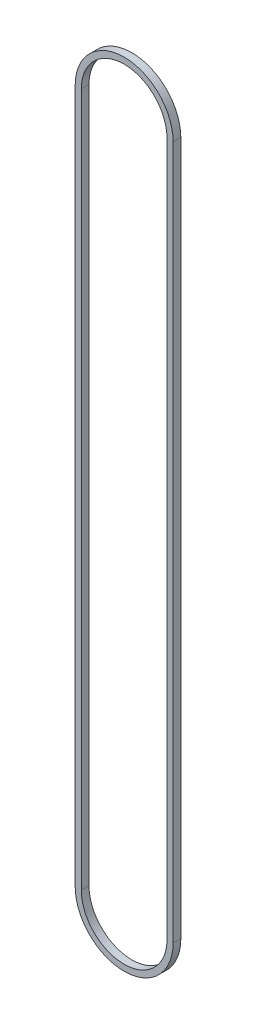
ISO-10303-21;
HEADER;
FILE_DESCRIPTION(('STEP AP214'),'2;1');
FILE_NAME('part.step','',(''),(''),'','','');
FILE_SCHEMA(('AUTOMOTIVE_DESIGN { 1 0 10303 214 1 1 1 1 }'));
ENDSEC;
DATA;
#1=APPLICATION_CONTEXT('core data for automotive mechanical design processes');
#2=APPLICATION_PROTOCOL_DEFINITION('international standard','automotive_design',2000,#1);
#3=PRODUCT_CONTEXT('',#1,'mechanical');
#4=PRODUCT('Part','Part','',(#3));
#5=PRODUCT_RELATED_PRODUCT_CATEGORY('part','',(#4));
#6=PRODUCT_DEFINITION_FORMATION('','',#4);
#7=PRODUCT_DEFINITION_CONTEXT('part definition',#1,'design');
#8=PRODUCT_DEFINITION('design','',#6,#7);
#9=PRODUCT_DEFINITION_SHAPE('','',#8);
#10=(LENGTH_UNIT() NAMED_UNIT(*) SI_UNIT(.MILLI.,.METRE.));
#11=(NAMED_UNIT(*) PLANE_ANGLE_UNIT() SI_UNIT($,.RADIAN.));
#12=(NAMED_UNIT(*) SI_UNIT($,.STERADIAN.) SOLID_ANGLE_UNIT());
#13=UNCERTAINTY_MEASURE_WITH_UNIT(LENGTH_MEASURE(1.E-05),#10,'distance_accuracy_value','');
#14=(GEOMETRIC_REPRESENTATION_CONTEXT(3) GLOBAL_UNCERTAINTY_ASSIGNED_CONTEXT((#13)) GLOBAL_UNIT_ASSIGNED_CONTEXT((#10,
#11,#12)) REPRESENTATION_CONTEXT('',''));
#15=CARTESIAN_POINT('',(0.,0.,0.));
#16=DIRECTION('',(0.,0.,1.));
#17=DIRECTION('',(1.,0.,0.));
#18=AXIS2_PLACEMENT_3D('',#15,#16,#17);
#19=CARTESIAN_POINT('',(-1.04094977927525E-13,850.,18.82));
#20=DIRECTION('',(0.,0.,1.));
#21=DIRECTION('',(1.,0.,0.));
#22=AXIS2_PLACEMENT_3D('',#19,#20,#21);
#23=PLANE('',#22);
#24=CARTESIAN_POINT('',(-1.04094977927525E-13,850.,18.82));
#25=DIRECTION('',(0.,0.,1.));
#26=DIRECTION('',(1.,0.,0.));
#27=AXIS2_PLACEMENT_3D('',#24,#25,#26);
#28=CIRCLE('',#27,120.);
#29=CARTESIAN_POINT('',(120.,850.,18.82));
#30=VERTEX_POINT('',#29);
#31=CARTESIAN_POINT('',(-120.,850.,18.82));
#32=VERTEX_POINT('',#31);
#33=EDGE_CURVE('E134',#30,#32,#28,.T.);
#34=ORIENTED_EDGE('',*,*,#33,.T.);
#35=DIRECTION('',(0.,-1.,0.));
#36=VECTOR('',#35,1.);
#37=CARTESIAN_POINT('',(-120.,850.,18.82));
#38=LINE('',#37,#36);
#39=CARTESIAN_POINT('',(-120.,-850.,18.82));
#40=VERTEX_POINT('',#39);
#41=EDGE_CURVE('E137',#32,#40,#38,.T.);
#42=ORIENTED_EDGE('',*,*,#41,.T.);
#43=CARTESIAN_POINT('',(0.,-850.,18.82));
#44=DIRECTION('',(0.,0.,1.));
#45=DIRECTION('',(1.,0.,0.));
#46=AXIS2_PLACEMENT_3D('',#43,#44,#45);
#47=CIRCLE('',#46,120.);
#48=CARTESIAN_POINT('',(120.,-850.,18.82));
#49=VERTEX_POINT('',#48);
#50=EDGE_CURVE('E140',#40,#49,#47,.T.);
#51=ORIENTED_EDGE('',*,*,#50,.T.);
#52=DIRECTION('',(0.,1.,0.));
#53=VECTOR('',#52,1.);
#54=CARTESIAN_POINT('',(120.,850.,18.82));
#55=LINE('',#54,#53);
#56=EDGE_CURVE('E142',#49,#30,#55,.T.);
#57=ORIENTED_EDGE('',*,*,#56,.T.);
#58=EDGE_LOOP('',(#34,#42,#51,#57));
#59=FACE_BOUND('',#58,.T.);
#60=DIRECTION('',(0.,-1.,0.));
#61=VECTOR('',#60,1.);
#62=CARTESIAN_POINT('',(-105.,850.,18.82));
#63=LINE('',#62,#61);
#64=CARTESIAN_POINT('',(-105.,850.,18.82));
#65=VERTEX_POINT('',#64);
#66=CARTESIAN_POINT('',(-105.,-850.,18.82));
#67=VERTEX_POINT('',#66);
#68=EDGE_CURVE('E106',#65,#67,#63,.T.);
#69=ORIENTED_EDGE('',*,*,#68,.F.);
#70=CARTESIAN_POINT('',(-1.04094977927525E-13,850.,18.82));
#71=DIRECTION('',(0.,0.,1.));
#72=DIRECTION('',(1.,0.,0.));
#73=AXIS2_PLACEMENT_3D('',#70,#71,#72);
#74=CIRCLE('',#73,105.);
#75=CARTESIAN_POINT('',(104.999999999999,850.,18.82));
#76=VERTEX_POINT('',#75);
#77=EDGE_CURVE('E98',#76,#65,#74,.T.);
#78=ORIENTED_EDGE('',*,*,#77,.F.);
#79=DIRECTION('',(0.,1.,0.));
#80=VECTOR('',#79,1.);
#81=CARTESIAN_POINT('',(104.999999999999,850.,18.82));
#82=LINE('',#81,#80);
#83=CARTESIAN_POINT('',(105.,-850.,18.82));
#84=VERTEX_POINT('',#83);
#85=EDGE_CURVE('E120',#84,#76,#82,.T.);
#86=ORIENTED_EDGE('',*,*,#85,.F.);
#87=CARTESIAN_POINT('',(0.,-850.,18.82));
#88=DIRECTION('',(0.,0.,1.));
#89=DIRECTION('',(1.,0.,0.));
#90=AXIS2_PLACEMENT_3D('',#87,#88,#89);
#91=CIRCLE('',#90,105.);
#92=EDGE_CURVE('E118',#67,#84,#91,.T.);
#93=ORIENTED_EDGE('',*,*,#92,.F.);
#94=EDGE_LOOP('',(#69,#78,#86,#93));
#95=FACE_BOUND('',#94,.T.);
#96=ADVANCED_FACE('F33',(#59,#95),#23,.T.);
#97=CARTESIAN_POINT('',(-1.04094977927525E-13,850.,0.));
#98=DIRECTION('',(0.,0.,1.));
#99=DIRECTION('',(1.,0.,0.));
#100=AXIS2_PLACEMENT_3D('',#97,#98,#99);
#101=PLANE('',#100);
#102=CARTESIAN_POINT('',(-1.04094977927525E-13,850.,0.));
#103=DIRECTION('',(0.,0.,1.));
#104=DIRECTION('',(1.,0.,0.));
#105=AXIS2_PLACEMENT_3D('',#102,#103,#104);
#106=CIRCLE('',#105,120.);
#107=CARTESIAN_POINT('',(120.,850.,0.));
#108=VERTEX_POINT('',#107);
#109=CARTESIAN_POINT('',(-120.,850.,0.));
#110=VERTEX_POINT('',#109);
#111=EDGE_CURVE('E114',#108,#110,#106,.T.);
#112=ORIENTED_EDGE('',*,*,#111,.F.);
#113=DIRECTION('',(0.,1.,0.));
#114=VECTOR('',#113,1.);
#115=CARTESIAN_POINT('',(120.,850.,0.));
#116=LINE('',#115,#114);
#117=CARTESIAN_POINT('',(120.,-850.,0.));
#118=VERTEX_POINT('',#117);
#119=EDGE_CURVE('E138',#118,#108,#116,.T.);
#120=ORIENTED_EDGE('',*,*,#119,.F.);
#121=CARTESIAN_POINT('',(0.,-850.,0.));
#122=DIRECTION('',(0.,0.,1.));
#123=DIRECTION('',(1.,0.,0.));
#124=AXIS2_PLACEMENT_3D('',#121,#122,#123);
#125=CIRCLE('',#124,120.);
#126=CARTESIAN_POINT('',(-120.,-850.,0.));
#127=VERTEX_POINT('',#126);
#128=EDGE_CURVE('E149',#127,#118,#125,.T.);
#129=ORIENTED_EDGE('',*,*,#128,.F.);
#130=DIRECTION('',(0.,-1.,0.));
#131=VECTOR('',#130,1.);
#132=CARTESIAN_POINT('',(-120.,850.,0.));
#133=LINE('',#132,#131);
#134=EDGE_CURVE('E147',#110,#127,#133,.T.);
#135=ORIENTED_EDGE('',*,*,#134,.F.);
#136=EDGE_LOOP('',(#112,#120,#129,#135));
#137=FACE_BOUND('',#136,.T.);
#138=CARTESIAN_POINT('',(-1.04094977927525E-13,850.,0.));
#139=DIRECTION('',(0.,0.,1.));
#140=DIRECTION('',(1.,0.,0.));
#141=AXIS2_PLACEMENT_3D('',#138,#139,#140);
#142=CIRCLE('',#141,105.);
#143=CARTESIAN_POINT('',(104.999999999999,850.,0.));
#144=VERTEX_POINT('',#143);
#145=CARTESIAN_POINT('',(-105.,850.,0.));
#146=VERTEX_POINT('',#145);
#147=EDGE_CURVE('E56',#144,#146,#142,.T.);
#148=ORIENTED_EDGE('',*,*,#147,.T.);
#149=DIRECTION('',(0.,-1.,0.));
#150=VECTOR('',#149,1.);
#151=CARTESIAN_POINT('',(-105.,850.,0.));
#152=LINE('',#151,#150);
#153=CARTESIAN_POINT('',(-105.,-850.,0.));
#154=VERTEX_POINT('',#153);
#155=EDGE_CURVE('E113',#146,#154,#152,.T.);
#156=ORIENTED_EDGE('',*,*,#155,.T.);
#157=CARTESIAN_POINT('',(0.,-850.,0.));
#158=DIRECTION('',(0.,0.,1.));
#159=DIRECTION('',(1.,0.,0.));
#160=AXIS2_PLACEMENT_3D('',#157,#158,#159);
#161=CIRCLE('',#160,105.);
#162=CARTESIAN_POINT('',(105.,-850.,0.));
#163=VERTEX_POINT('',#162);
#164=EDGE_CURVE('E126',#154,#163,#161,.T.);
#165=ORIENTED_EDGE('',*,*,#164,.T.);
#166=DIRECTION('',(0.,1.,0.));
#167=VECTOR('',#166,1.);
#168=CARTESIAN_POINT('',(104.999999999999,850.,0.));
#169=LINE('',#168,#167);
#170=EDGE_CURVE('E107',#163,#144,#169,.T.);
#171=ORIENTED_EDGE('',*,*,#170,.T.);
#172=EDGE_LOOP('',(#148,#156,#165,#171));
#173=FACE_BOUND('',#172,.T.);
#174=ADVANCED_FACE('F167',(#137,#173),#101,.F.);
#175=CARTESIAN_POINT('',(-1.04094977927525E-13,850.,18.82));
#176=DIRECTION('',(0.,0.,-1.));
#177=DIRECTION('',(-1.,0.,0.));
#178=AXIS2_PLACEMENT_3D('',#175,#176,#177);
#179=CYLINDRICAL_SURFACE('',#178,120.);
#180=ORIENTED_EDGE('',*,*,#111,.T.);
#181=DIRECTION('',(0.,0.,-1.));
#182=VECTOR('',#181,1.);
#183=CARTESIAN_POINT('',(-120.,850.,18.82));
#184=LINE('',#183,#182);
#185=EDGE_CURVE('E11',#32,#110,#184,.T.);
#186=ORIENTED_EDGE('',*,*,#185,.F.);
#187=ORIENTED_EDGE('',*,*,#33,.F.);
#188=DIRECTION('',(0.,0.,-1.));
#189=VECTOR('',#188,1.);
#190=CARTESIAN_POINT('',(120.,850.,18.82));
#191=LINE('',#190,#189);
#192=EDGE_CURVE('E144',#30,#108,#191,.T.);
#193=ORIENTED_EDGE('',*,*,#192,.T.);
#194=EDGE_LOOP('',(#180,#186,#187,#193));
#195=FACE_BOUND('',#194,.T.);
#196=ADVANCED_FACE('F35',(#195),#179,.T.);
#197=CARTESIAN_POINT('',(-120.,850.,18.82));
#198=DIRECTION('',(1.,0.,0.));
#199=DIRECTION('',(0.,1.,0.));
#200=AXIS2_PLACEMENT_3D('',#197,#198,#199);
#201=PLANE('',#200);
#202=ORIENTED_EDGE('',*,*,#134,.T.);
#203=DIRECTION('',(0.,0.,-1.));
#204=VECTOR('',#203,1.);
#205=CARTESIAN_POINT('',(-120.,-850.,18.82));
#206=LINE('',#205,#204);
#207=EDGE_CURVE('E41',#40,#127,#206,.T.);
#208=ORIENTED_EDGE('',*,*,#207,.F.);
#209=ORIENTED_EDGE('',*,*,#41,.F.);
#210=ORIENTED_EDGE('',*,*,#185,.T.);
#211=EDGE_LOOP('',(#202,#208,#209,#210));
#212=FACE_BOUND('',#211,.T.);
#213=ADVANCED_FACE('F177',(#212),#201,.F.);
#214=CARTESIAN_POINT('',(0.,-850.,18.82));
#215=DIRECTION('',(0.,0.,-1.));
#216=DIRECTION('',(-1.,0.,0.));
#217=AXIS2_PLACEMENT_3D('',#214,#215,#216);
#218=CYLINDRICAL_SURFACE('',#217,120.);
#219=ORIENTED_EDGE('',*,*,#128,.T.);
#220=DIRECTION('',(0.,0.,-1.));
#221=VECTOR('',#220,1.);
#222=CARTESIAN_POINT('',(120.,-850.,18.82));
#223=LINE('',#222,#221);
#224=EDGE_CURVE('E154',#49,#118,#223,.T.);
#225=ORIENTED_EDGE('',*,*,#224,.F.);
#226=ORIENTED_EDGE('',*,*,#50,.F.);
#227=ORIENTED_EDGE('',*,*,#207,.T.);
#228=EDGE_LOOP('',(#219,#225,#226,#227));
#229=FACE_BOUND('',#228,.T.);
#230=ADVANCED_FACE('F161',(#229),#218,.T.);
#231=CARTESIAN_POINT('',(120.,850.,18.82));
#232=DIRECTION('',(-1.,0.,0.));
#233=DIRECTION('',(0.,-1.,0.));
#234=AXIS2_PLACEMENT_3D('',#231,#232,#233);
#235=PLANE('',#234);
#236=ORIENTED_EDGE('',*,*,#119,.T.);
#237=ORIENTED_EDGE('',*,*,#192,.F.);
#238=ORIENTED_EDGE('',*,*,#56,.F.);
#239=ORIENTED_EDGE('',*,*,#224,.T.);
#240=EDGE_LOOP('',(#236,#237,#238,#239));
#241=FACE_BOUND('',#240,.T.);
#242=ADVANCED_FACE('F171',(#241),#235,.F.);
#243=CARTESIAN_POINT('',(-1.04094977927525E-13,850.,18.82));
#244=DIRECTION('',(0.,0.,-1.));
#245=DIRECTION('',(-1.,0.,0.));
#246=AXIS2_PLACEMENT_3D('',#243,#244,#245);
#247=CYLINDRICAL_SURFACE('',#246,105.);
#248=ORIENTED_EDGE('',*,*,#147,.F.);
#249=DIRECTION('',(0.,0.,-1.));
#250=VECTOR('',#249,1.);
#251=CARTESIAN_POINT('',(104.999999999999,850.,18.82));
#252=LINE('',#251,#250);
#253=EDGE_CURVE('E102',#76,#144,#252,.T.);
#254=ORIENTED_EDGE('',*,*,#253,.F.);
#255=ORIENTED_EDGE('',*,*,#77,.T.);
#256=DIRECTION('',(0.,0.,-1.));
#257=VECTOR('',#256,1.);
#258=CARTESIAN_POINT('',(-105.,850.,18.82));
#259=LINE('',#258,#257);
#260=EDGE_CURVE('E101',#65,#146,#259,.T.);
#261=ORIENTED_EDGE('',*,*,#260,.T.);
#262=EDGE_LOOP('',(#248,#254,#255,#261));
#263=FACE_BOUND('',#262,.T.);
#264=ADVANCED_FACE('F100',(#263),#247,.F.);
#265=CARTESIAN_POINT('',(-105.,850.,18.82));
#266=DIRECTION('',(1.,0.,0.));
#267=DIRECTION('',(0.,1.,0.));
#268=AXIS2_PLACEMENT_3D('',#265,#266,#267);
#269=PLANE('',#268);
#270=ORIENTED_EDGE('',*,*,#155,.F.);
#271=ORIENTED_EDGE('',*,*,#260,.F.);
#272=ORIENTED_EDGE('',*,*,#68,.T.);
#273=DIRECTION('',(0.,0.,-1.));
#274=VECTOR('',#273,1.);
#275=CARTESIAN_POINT('',(-105.,-850.,18.82));
#276=LINE('',#275,#274);
#277=EDGE_CURVE('E115',#67,#154,#276,.T.);
#278=ORIENTED_EDGE('',*,*,#277,.T.);
#279=EDGE_LOOP('',(#270,#271,#272,#278));
#280=FACE_BOUND('',#279,.T.);
#281=ADVANCED_FACE('F110',(#280),#269,.T.);
#282=CARTESIAN_POINT('',(0.,-850.,18.82));
#283=DIRECTION('',(0.,0.,-1.));
#284=DIRECTION('',(-1.,0.,0.));
#285=AXIS2_PLACEMENT_3D('',#282,#283,#284);
#286=CYLINDRICAL_SURFACE('',#285,105.);
#287=ORIENTED_EDGE('',*,*,#164,.F.);
#288=ORIENTED_EDGE('',*,*,#277,.F.);
#289=ORIENTED_EDGE('',*,*,#92,.T.);
#290=DIRECTION('',(0.,0.,-1.));
#291=VECTOR('',#290,1.);
#292=CARTESIAN_POINT('',(105.,-850.,18.82));
#293=LINE('',#292,#291);
#294=EDGE_CURVE('E48',#84,#163,#293,.T.);
#295=ORIENTED_EDGE('',*,*,#294,.T.);
#296=EDGE_LOOP('',(#287,#288,#289,#295));
#297=FACE_BOUND('',#296,.T.);
#298=ADVANCED_FACE('F200',(#297),#286,.F.);
#299=CARTESIAN_POINT('',(104.999999999999,850.,18.82));
#300=DIRECTION('',(-1.,0.,0.));
#301=DIRECTION('',(0.,-1.,0.));
#302=AXIS2_PLACEMENT_3D('',#299,#300,#301);
#303=PLANE('',#302);
#304=ORIENTED_EDGE('',*,*,#170,.F.);
#305=ORIENTED_EDGE('',*,*,#294,.F.);
#306=ORIENTED_EDGE('',*,*,#85,.T.);
#307=ORIENTED_EDGE('',*,*,#253,.T.);
#308=EDGE_LOOP('',(#304,#305,#306,#307));
#309=FACE_BOUND('',#308,.T.);
#310=ADVANCED_FACE('F204',(#309),#303,.T.);
#311=CLOSED_SHELL('',(#96,#174,#196,#213,#230,#242,#264,#281,#298,#310));
#312=MANIFOLD_SOLID_BREP('B2',#311);
#313=ADVANCED_BREP_SHAPE_REPRESENTATION('',(#18,#312),#14);
#314=SHAPE_DEFINITION_REPRESENTATION(#9,#313);
ENDSEC;
END-ISO-10303-21;
